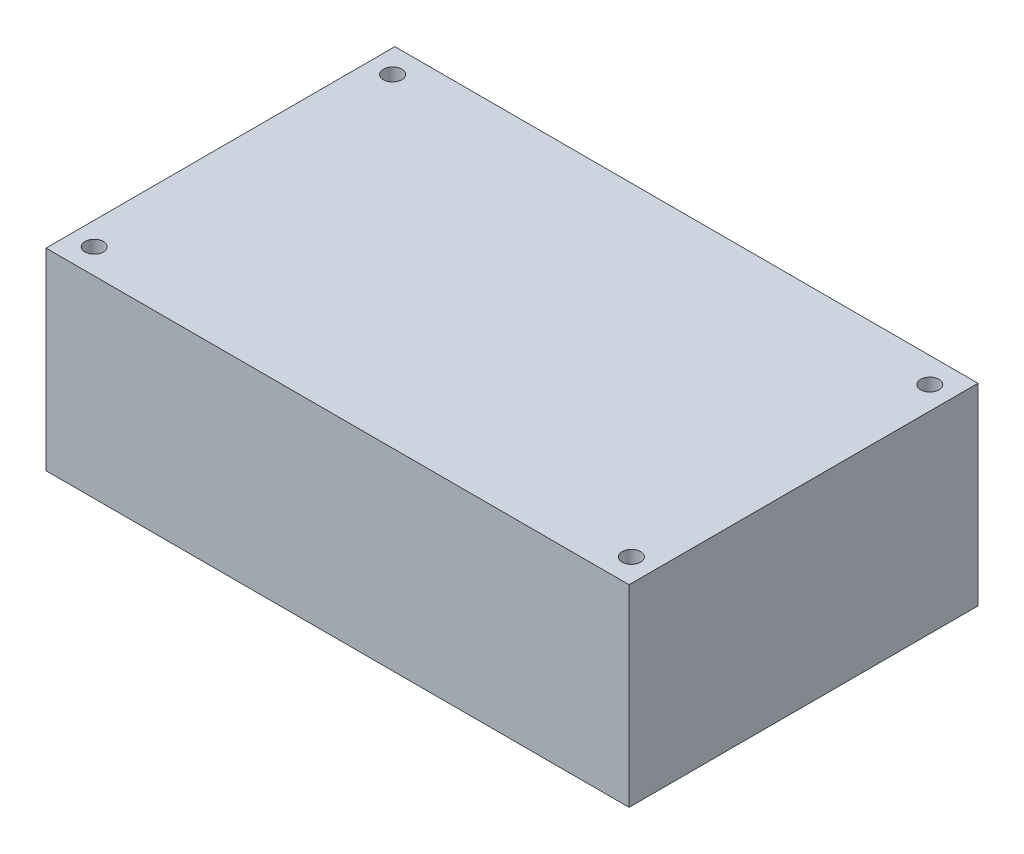
ISO-10303-21;
HEADER;
FILE_DESCRIPTION(('STEP AP214'),'2;1');
FILE_NAME('part.step','',(''),(''),'','','');
FILE_SCHEMA(('AUTOMOTIVE_DESIGN { 1 0 10303 214 1 1 1 1 }'));
ENDSEC;
DATA;
#1=APPLICATION_CONTEXT('core data for automotive mechanical design processes');
#2=APPLICATION_PROTOCOL_DEFINITION('international standard','automotive_design',2000,#1);
#3=PRODUCT_CONTEXT('',#1,'mechanical');
#4=PRODUCT('Part','Part','',(#3));
#5=PRODUCT_RELATED_PRODUCT_CATEGORY('part','',(#4));
#6=PRODUCT_DEFINITION_FORMATION('','',#4);
#7=PRODUCT_DEFINITION_CONTEXT('part definition',#1,'design');
#8=PRODUCT_DEFINITION('design','',#6,#7);
#9=PRODUCT_DEFINITION_SHAPE('','',#8);
#10=(LENGTH_UNIT() NAMED_UNIT(*) SI_UNIT(.MILLI.,.METRE.));
#11=(NAMED_UNIT(*) PLANE_ANGLE_UNIT() SI_UNIT($,.RADIAN.));
#12=(NAMED_UNIT(*) SI_UNIT($,.STERADIAN.) SOLID_ANGLE_UNIT());
#13=UNCERTAINTY_MEASURE_WITH_UNIT(LENGTH_MEASURE(1.E-05),#10,'distance_accuracy_value','');
#14=(GEOMETRIC_REPRESENTATION_CONTEXT(3) GLOBAL_UNCERTAINTY_ASSIGNED_CONTEXT((#13)) GLOBAL_UNIT_ASSIGNED_CONTEXT((#10,
#11,#12)) REPRESENTATION_CONTEXT('',''));
#15=CARTESIAN_POINT('',(0.,0.,0.));
#16=DIRECTION('',(0.,0.,1.));
#17=DIRECTION('',(1.,0.,0.));
#18=AXIS2_PLACEMENT_3D('',#15,#16,#17);
#19=CARTESIAN_POINT('',(63.5,42.,38.));
#20=DIRECTION('',(-1.,0.,0.));
#21=DIRECTION('',(0.,0.,1.));
#22=AXIS2_PLACEMENT_3D('',#19,#20,#21);
#23=PLANE('',#22);
#24=DIRECTION('',(0.,0.,-1.));
#25=VECTOR('',#24,1.);
#26=CARTESIAN_POINT('',(63.5,0.,38.));
#27=LINE('',#26,#25);
#28=CARTESIAN_POINT('',(63.5,0.,38.));
#29=VERTEX_POINT('',#28);
#30=CARTESIAN_POINT('',(63.5,0.,-38.));
#31=VERTEX_POINT('',#30);
#32=EDGE_CURVE('E96',#29,#31,#27,.T.);
#33=ORIENTED_EDGE('',*,*,#32,.T.);
#34=DIRECTION('',(0.,-1.,0.));
#35=VECTOR('',#34,1.);
#36=CARTESIAN_POINT('',(63.5,42.,-38.));
#37=LINE('',#36,#35);
#38=CARTESIAN_POINT('',(63.5,42.,-38.));
#39=VERTEX_POINT('',#38);
#40=EDGE_CURVE('E11',#39,#31,#37,.T.);
#41=ORIENTED_EDGE('',*,*,#40,.F.);
#42=DIRECTION('',(0.,0.,-1.));
#43=VECTOR('',#42,1.);
#44=CARTESIAN_POINT('',(63.5,42.,38.));
#45=LINE('',#44,#43);
#46=CARTESIAN_POINT('',(63.5,42.,38.));
#47=VERTEX_POINT('',#46);
#48=EDGE_CURVE('E84',#47,#39,#45,.T.);
#49=ORIENTED_EDGE('',*,*,#48,.F.);
#50=DIRECTION('',(0.,-1.,0.));
#51=VECTOR('',#50,1.);
#52=CARTESIAN_POINT('',(63.5,42.,38.));
#53=LINE('',#52,#51);
#54=EDGE_CURVE('E92',#47,#29,#53,.T.);
#55=ORIENTED_EDGE('',*,*,#54,.T.);
#56=EDGE_LOOP('',(#33,#41,#49,#55));
#57=FACE_BOUND('',#56,.T.);
#58=ADVANCED_FACE('F33',(#57),#23,.F.);
#59=CARTESIAN_POINT('',(-63.5,42.,-38.));
#60=DIRECTION('',(0.,0.,1.));
#61=DIRECTION('',(1.,0.,0.));
#62=AXIS2_PLACEMENT_3D('',#59,#60,#61);
#63=PLANE('',#62);
#64=DIRECTION('',(-1.,0.,0.));
#65=VECTOR('',#64,1.);
#66=CARTESIAN_POINT('',(-63.5,0.,-38.));
#67=LINE('',#66,#65);
#68=CARTESIAN_POINT('',(-63.5,0.,-38.));
#69=VERTEX_POINT('',#68);
#70=EDGE_CURVE('E88',#31,#69,#67,.T.);
#71=ORIENTED_EDGE('',*,*,#70,.T.);
#72=DIRECTION('',(0.,-1.,0.));
#73=VECTOR('',#72,1.);
#74=CARTESIAN_POINT('',(-63.5,42.,-38.));
#75=LINE('',#74,#73);
#76=CARTESIAN_POINT('',(-63.5,42.,-38.));
#77=VERTEX_POINT('',#76);
#78=EDGE_CURVE('E41',#77,#69,#75,.T.);
#79=ORIENTED_EDGE('',*,*,#78,.F.);
#80=DIRECTION('',(-1.,0.,0.));
#81=VECTOR('',#80,1.);
#82=CARTESIAN_POINT('',(-63.5,42.,-38.));
#83=LINE('',#82,#81);
#84=EDGE_CURVE('E79',#39,#77,#83,.T.);
#85=ORIENTED_EDGE('',*,*,#84,.F.);
#86=ORIENTED_EDGE('',*,*,#40,.T.);
#87=EDGE_LOOP('',(#71,#79,#85,#86));
#88=FACE_BOUND('',#87,.T.);
#89=ADVANCED_FACE('F87',(#88),#63,.F.);
#90=CARTESIAN_POINT('',(-63.5,42.,38.));
#91=DIRECTION('',(1.,0.,0.));
#92=DIRECTION('',(0.,0.,-1.));
#93=AXIS2_PLACEMENT_3D('',#90,#91,#92);
#94=PLANE('',#93);
#95=DIRECTION('',(0.,0.,1.));
#96=VECTOR('',#95,1.);
#97=CARTESIAN_POINT('',(-63.5,0.,38.));
#98=LINE('',#97,#96);
#99=CARTESIAN_POINT('',(-63.5,0.,38.));
#100=VERTEX_POINT('',#99);
#101=EDGE_CURVE('E66',#69,#100,#98,.T.);
#102=ORIENTED_EDGE('',*,*,#101,.T.);
#103=DIRECTION('',(0.,-1.,0.));
#104=VECTOR('',#103,1.);
#105=CARTESIAN_POINT('',(-63.5,42.,38.));
#106=LINE('',#105,#104);
#107=CARTESIAN_POINT('',(-63.5,42.,38.));
#108=VERTEX_POINT('',#107);
#109=EDGE_CURVE('E89',#108,#100,#106,.T.);
#110=ORIENTED_EDGE('',*,*,#109,.F.);
#111=DIRECTION('',(0.,0.,1.));
#112=VECTOR('',#111,1.);
#113=CARTESIAN_POINT('',(-63.5,42.,38.));
#114=LINE('',#113,#112);
#115=EDGE_CURVE('E82',#77,#108,#114,.T.);
#116=ORIENTED_EDGE('',*,*,#115,.F.);
#117=ORIENTED_EDGE('',*,*,#78,.T.);
#118=EDGE_LOOP('',(#102,#110,#116,#117));
#119=FACE_BOUND('',#118,.T.);
#120=ADVANCED_FACE('F90',(#119),#94,.F.);
#121=CARTESIAN_POINT('',(-63.5,42.,38.));
#122=DIRECTION('',(0.,0.,-1.));
#123=DIRECTION('',(-1.,0.,0.));
#124=AXIS2_PLACEMENT_3D('',#121,#122,#123);
#125=PLANE('',#124);
#126=DIRECTION('',(1.,0.,0.));
#127=VECTOR('',#126,1.);
#128=CARTESIAN_POINT('',(-63.5,0.,38.));
#129=LINE('',#128,#127);
#130=EDGE_CURVE('E72',#100,#29,#129,.T.);
#131=ORIENTED_EDGE('',*,*,#130,.T.);
#132=ORIENTED_EDGE('',*,*,#54,.F.);
#133=DIRECTION('',(1.,0.,0.));
#134=VECTOR('',#133,1.);
#135=CARTESIAN_POINT('',(-63.5,42.,38.));
#136=LINE('',#135,#134);
#137=EDGE_CURVE('E49',#108,#47,#136,.T.);
#138=ORIENTED_EDGE('',*,*,#137,.F.);
#139=ORIENTED_EDGE('',*,*,#109,.T.);
#140=EDGE_LOOP('',(#131,#132,#138,#139));
#141=FACE_BOUND('',#140,.T.);
#142=ADVANCED_FACE('F104',(#141),#125,.F.);
#143=CARTESIAN_POINT('',(0.,42.,0.));
#144=DIRECTION('',(0.,-1.,0.));
#145=DIRECTION('',(0.,0.,-1.));
#146=AXIS2_PLACEMENT_3D('',#143,#144,#145);
#147=PLANE('',#146);
#148=CARTESIAN_POINT('',(-58.4999999999993,42.,32.5));
#149=DIRECTION('',(0.,1.,0.));
#150=DIRECTION('',(0.,0.,1.));
#151=AXIS2_PLACEMENT_3D('',#148,#149,#150);
#152=CIRCLE('',#151,2.);
#153=CARTESIAN_POINT('',(-58.4999999999993,42.,34.5));
#154=VERTEX_POINT('',#153);
#155=EDGE_CURVE('E116',#154,#154,#152,.T.);
#156=ORIENTED_EDGE('',*,*,#155,.F.);
#157=EDGE_LOOP('',(#156));
#158=FACE_BOUND('',#157,.T.);
#159=CARTESIAN_POINT('',(58.5000000000007,42.,32.5));
#160=DIRECTION('',(0.,1.,0.));
#161=DIRECTION('',(0.,0.,1.));
#162=AXIS2_PLACEMENT_3D('',#159,#160,#161);
#163=CIRCLE('',#162,2.);
#164=CARTESIAN_POINT('',(58.5000000000007,42.,34.5));
#165=VERTEX_POINT('',#164);
#166=EDGE_CURVE('E122',#165,#165,#163,.T.);
#167=ORIENTED_EDGE('',*,*,#166,.F.);
#168=EDGE_LOOP('',(#167));
#169=FACE_BOUND('',#168,.T.);
#170=CARTESIAN_POINT('',(58.5,42.,-32.5));
#171=DIRECTION('',(0.,1.,0.));
#172=DIRECTION('',(0.,0.,1.));
#173=AXIS2_PLACEMENT_3D('',#170,#171,#172);
#174=CIRCLE('',#173,2.);
#175=CARTESIAN_POINT('',(58.5,42.,-30.5));
#176=VERTEX_POINT('',#175);
#177=EDGE_CURVE('E128',#176,#176,#174,.T.);
#178=ORIENTED_EDGE('',*,*,#177,.F.);
#179=EDGE_LOOP('',(#178));
#180=FACE_BOUND('',#179,.T.);
#181=CARTESIAN_POINT('',(-58.5,42.,-32.5));
#182=DIRECTION('',(0.,1.,0.));
#183=DIRECTION('',(0.,0.,1.));
#184=AXIS2_PLACEMENT_3D('',#181,#182,#183);
#185=CIRCLE('',#184,2.);
#186=CARTESIAN_POINT('',(-58.5,42.,-30.5));
#187=VERTEX_POINT('',#186);
#188=EDGE_CURVE('E110',#187,#187,#185,.T.);
#189=ORIENTED_EDGE('',*,*,#188,.F.);
#190=EDGE_LOOP('',(#189));
#191=FACE_BOUND('',#190,.T.);
#192=ORIENTED_EDGE('',*,*,#48,.T.);
#193=ORIENTED_EDGE('',*,*,#84,.T.);
#194=ORIENTED_EDGE('',*,*,#115,.T.);
#195=ORIENTED_EDGE('',*,*,#137,.T.);
#196=EDGE_LOOP('',(#192,#193,#194,#195));
#197=FACE_BOUND('',#196,.T.);
#198=ADVANCED_FACE('F80',(#158,#169,#180,#191,#197),#147,.F.);
#199=CARTESIAN_POINT('',(0.,0.,0.));
#200=DIRECTION('',(0.,-1.,0.));
#201=DIRECTION('',(0.,0.,-1.));
#202=AXIS2_PLACEMENT_3D('',#199,#200,#201);
#203=PLANE('',#202);
#204=CARTESIAN_POINT('',(-58.4999999999993,0.,32.5));
#205=DIRECTION('',(0.,1.,0.));
#206=DIRECTION('',(0.,0.,1.));
#207=AXIS2_PLACEMENT_3D('',#204,#205,#206);
#208=CIRCLE('',#207,2.);
#209=CARTESIAN_POINT('',(-58.4999999999993,0.,34.5));
#210=VERTEX_POINT('',#209);
#211=EDGE_CURVE('E119',#210,#210,#208,.T.);
#212=ORIENTED_EDGE('',*,*,#211,.T.);
#213=EDGE_LOOP('',(#212));
#214=FACE_BOUND('',#213,.T.);
#215=CARTESIAN_POINT('',(58.5000000000007,0.,32.5));
#216=DIRECTION('',(0.,1.,0.));
#217=DIRECTION('',(0.,0.,1.));
#218=AXIS2_PLACEMENT_3D('',#215,#216,#217);
#219=CIRCLE('',#218,2.);
#220=CARTESIAN_POINT('',(58.5000000000007,0.,34.5));
#221=VERTEX_POINT('',#220);
#222=EDGE_CURVE('E125',#221,#221,#219,.T.);
#223=ORIENTED_EDGE('',*,*,#222,.T.);
#224=EDGE_LOOP('',(#223));
#225=FACE_BOUND('',#224,.T.);
#226=CARTESIAN_POINT('',(58.5,0.,-32.5));
#227=DIRECTION('',(0.,1.,0.));
#228=DIRECTION('',(0.,0.,1.));
#229=AXIS2_PLACEMENT_3D('',#226,#227,#228);
#230=CIRCLE('',#229,2.);
#231=CARTESIAN_POINT('',(58.5,0.,-30.5));
#232=VERTEX_POINT('',#231);
#233=EDGE_CURVE('E113',#232,#232,#230,.T.);
#234=ORIENTED_EDGE('',*,*,#233,.T.);
#235=EDGE_LOOP('',(#234));
#236=FACE_BOUND('',#235,.T.);
#237=CARTESIAN_POINT('',(-58.5,0.,-32.5));
#238=DIRECTION('',(0.,1.,0.));
#239=DIRECTION('',(0.,0.,1.));
#240=AXIS2_PLACEMENT_3D('',#237,#238,#239);
#241=CIRCLE('',#240,2.);
#242=CARTESIAN_POINT('',(-58.5,0.,-30.5));
#243=VERTEX_POINT('',#242);
#244=EDGE_CURVE('E99',#243,#243,#241,.T.);
#245=ORIENTED_EDGE('',*,*,#244,.T.);
#246=EDGE_LOOP('',(#245));
#247=FACE_BOUND('',#246,.T.);
#248=ORIENTED_EDGE('',*,*,#32,.F.);
#249=ORIENTED_EDGE('',*,*,#130,.F.);
#250=ORIENTED_EDGE('',*,*,#101,.F.);
#251=ORIENTED_EDGE('',*,*,#70,.F.);
#252=EDGE_LOOP('',(#248,#249,#250,#251));
#253=FACE_BOUND('',#252,.T.);
#254=ADVANCED_FACE('F107',(#214,#225,#236,#247,#253),#203,.T.);
#255=CARTESIAN_POINT('',(-58.5,0.,-32.5));
#256=DIRECTION('',(0.,1.,0.));
#257=DIRECTION('',(0.,0.,1.));
#258=AXIS2_PLACEMENT_3D('',#255,#256,#257);
#259=CYLINDRICAL_SURFACE('',#258,2.);
#260=CARTESIAN_POINT('',(-58.5,0.,-30.5));
#261=CARTESIAN_POINT('',(-58.5,0.437499999999999,-30.5));
#262=CARTESIAN_POINT('',(-58.5,0.875,-30.5));
#263=CARTESIAN_POINT('',(-58.5,1.75,-30.5));
#264=CARTESIAN_POINT('',(-58.5,2.1875,-30.5));
#265=CARTESIAN_POINT('',(-58.5,3.0625,-30.5));
#266=CARTESIAN_POINT('',(-58.5,3.5,-30.5));
#267=CARTESIAN_POINT('',(-58.5,4.375,-30.5));
#268=CARTESIAN_POINT('',(-58.5,4.8125,-30.5));
#269=CARTESIAN_POINT('',(-58.5,5.6875,-30.5));
#270=CARTESIAN_POINT('',(-58.5,6.125,-30.5));
#271=CARTESIAN_POINT('',(-58.5,7.,-30.5));
#272=CARTESIAN_POINT('',(-58.5,7.4375,-30.5));
#273=CARTESIAN_POINT('',(-58.5,8.3125,-30.5));
#274=CARTESIAN_POINT('',(-58.5,8.75,-30.5));
#275=CARTESIAN_POINT('',(-58.5,9.625,-30.5));
#276=CARTESIAN_POINT('',(-58.5,10.0625,-30.5));
#277=CARTESIAN_POINT('',(-58.5,10.9375,-30.5));
#278=CARTESIAN_POINT('',(-58.5,11.375,-30.5));
#279=CARTESIAN_POINT('',(-58.5,12.25,-30.5));
#280=CARTESIAN_POINT('',(-58.5,12.6875,-30.5));
#281=CARTESIAN_POINT('',(-58.5,13.5625,-30.5));
#282=CARTESIAN_POINT('',(-58.5,14.,-30.5));
#283=CARTESIAN_POINT('',(-58.5,14.875,-30.5));
#284=CARTESIAN_POINT('',(-58.5,15.3125,-30.5));
#285=CARTESIAN_POINT('',(-58.5,16.1875,-30.5));
#286=CARTESIAN_POINT('',(-58.5,16.625,-30.5));
#287=CARTESIAN_POINT('',(-58.5,17.5,-30.5));
#288=CARTESIAN_POINT('',(-58.5,17.9375,-30.5));
#289=CARTESIAN_POINT('',(-58.5,18.8125,-30.5));
#290=CARTESIAN_POINT('',(-58.5,19.25,-30.5));
#291=CARTESIAN_POINT('',(-58.5,20.125,-30.5));
#292=CARTESIAN_POINT('',(-58.5,20.5625,-30.5));
#293=CARTESIAN_POINT('',(-58.5,21.4375,-30.5));
#294=CARTESIAN_POINT('',(-58.5,21.875,-30.5));
#295=CARTESIAN_POINT('',(-58.5,22.75,-30.5));
#296=CARTESIAN_POINT('',(-58.5,23.1875,-30.5));
#297=CARTESIAN_POINT('',(-58.5,24.0625,-30.5));
#298=CARTESIAN_POINT('',(-58.5,24.5,-30.5));
#299=CARTESIAN_POINT('',(-58.5,25.375,-30.5));
#300=CARTESIAN_POINT('',(-58.5,25.8125,-30.5));
#301=CARTESIAN_POINT('',(-58.5,26.6875,-30.5));
#302=CARTESIAN_POINT('',(-58.5,27.125,-30.5));
#303=CARTESIAN_POINT('',(-58.5,28.,-30.5));
#304=CARTESIAN_POINT('',(-58.5,28.4375,-30.5));
#305=CARTESIAN_POINT('',(-58.5,29.3125,-30.5));
#306=CARTESIAN_POINT('',(-58.5,29.75,-30.5));
#307=CARTESIAN_POINT('',(-58.5,30.625,-30.5));
#308=CARTESIAN_POINT('',(-58.5,31.0625,-30.5));
#309=CARTESIAN_POINT('',(-58.5,31.9375,-30.5));
#310=CARTESIAN_POINT('',(-58.5,32.375,-30.5));
#311=CARTESIAN_POINT('',(-58.5,33.25,-30.5));
#312=CARTESIAN_POINT('',(-58.5,33.6875,-30.5));
#313=CARTESIAN_POINT('',(-58.5,34.5625,-30.5));
#314=CARTESIAN_POINT('',(-58.5,35.,-30.5));
#315=CARTESIAN_POINT('',(-58.5,35.875,-30.5));
#316=CARTESIAN_POINT('',(-58.5,36.3125,-30.5));
#317=CARTESIAN_POINT('',(-58.5,37.1875,-30.5));
#318=CARTESIAN_POINT('',(-58.5,37.625,-30.5));
#319=CARTESIAN_POINT('',(-58.5,38.5,-30.5));
#320=CARTESIAN_POINT('',(-58.5,38.9375,-30.5));
#321=CARTESIAN_POINT('',(-58.5,39.8125,-30.5));
#322=CARTESIAN_POINT('',(-58.5,40.25,-30.5));
#323=CARTESIAN_POINT('',(-58.5,41.125,-30.5));
#324=CARTESIAN_POINT('',(-58.5,41.5625,-30.5));
#325=CARTESIAN_POINT('',(-58.5,42.,-30.5));
#326=B_SPLINE_CURVE_WITH_KNOTS('',3,(#260,#261,#262,#263,#264,#265,#266,#267,#268,#269,#270,
#271,#272,#273,#274,#275,#276,#277,#278,#279,#280,#281,#282,#283,#284,#285,#286,#287,#288,#289,
#290,#291,#292,#293,#294,#295,#296,#297,#298,#299,#300,#301,#302,#303,#304,#305,#306,#307,#308,
#309,#310,#311,#312,#313,#314,#315,#316,#317,#318,#319,#320,#321,#322,#323,#324,#325),
.UNSPECIFIED.,.F.,.F.,(4,2,2,2,2,2,2,2,2,2,2,2,2,2,2,2,2,2,2,2,2,2,2,2,2,2,2,2,2,2,2,2,4),(0.,
1.3125,2.625,3.9375,5.25,6.5625,7.875,9.1875,10.5,11.8125,13.125,14.4375,15.75,17.0625,18.375,
19.6875,21.,22.3125,23.625,24.9375,26.25,27.5625,28.875,30.1875,31.5,32.8125,34.125,35.4375,
36.75,38.0625,39.375,40.6875,42.),.UNSPECIFIED.);
#327=EDGE_CURVE('BSEAM140',#243,#187,#326,.T.);
#328=ORIENTED_EDGE('',*,*,#244,.F.);
#329=ORIENTED_EDGE('',*,*,#188,.T.);
#330=ORIENTED_EDGE('',*,*,#327,.T.);
#331=ORIENTED_EDGE('',*,*,#327,.F.);
#332=EDGE_LOOP('',(#328,#330,#329,#331));
#333=FACE_BOUND('',#332,.T.);
#334=ADVANCED_FACE('F140',(#333),#259,.F.);
#335=CARTESIAN_POINT('',(58.5,0.,-32.5));
#336=DIRECTION('',(0.,1.,0.));
#337=DIRECTION('',(0.,0.,1.));
#338=AXIS2_PLACEMENT_3D('',#335,#336,#337);
#339=CYLINDRICAL_SURFACE('',#338,2.);
#340=CARTESIAN_POINT('',(58.5,0.,-30.5));
#341=CARTESIAN_POINT('',(58.5,0.437499999999999,-30.5));
#342=CARTESIAN_POINT('',(58.5,0.875,-30.5));
#343=CARTESIAN_POINT('',(58.5,1.75,-30.5));
#344=CARTESIAN_POINT('',(58.5,2.1875,-30.5));
#345=CARTESIAN_POINT('',(58.5,3.0625,-30.5));
#346=CARTESIAN_POINT('',(58.5,3.5,-30.5));
#347=CARTESIAN_POINT('',(58.5,4.375,-30.5));
#348=CARTESIAN_POINT('',(58.5,4.8125,-30.5));
#349=CARTESIAN_POINT('',(58.5,5.6875,-30.5));
#350=CARTESIAN_POINT('',(58.5,6.125,-30.5));
#351=CARTESIAN_POINT('',(58.5,7.,-30.5));
#352=CARTESIAN_POINT('',(58.5,7.4375,-30.5));
#353=CARTESIAN_POINT('',(58.5,8.3125,-30.5));
#354=CARTESIAN_POINT('',(58.5,8.75,-30.5));
#355=CARTESIAN_POINT('',(58.5,9.625,-30.5));
#356=CARTESIAN_POINT('',(58.5,10.0625,-30.5));
#357=CARTESIAN_POINT('',(58.5,10.9375,-30.5));
#358=CARTESIAN_POINT('',(58.5,11.375,-30.5));
#359=CARTESIAN_POINT('',(58.5,12.25,-30.5));
#360=CARTESIAN_POINT('',(58.5,12.6875,-30.5));
#361=CARTESIAN_POINT('',(58.5,13.5625,-30.5));
#362=CARTESIAN_POINT('',(58.5,14.,-30.5));
#363=CARTESIAN_POINT('',(58.5,14.875,-30.5));
#364=CARTESIAN_POINT('',(58.5,15.3125,-30.5));
#365=CARTESIAN_POINT('',(58.5,16.1875,-30.5));
#366=CARTESIAN_POINT('',(58.5,16.625,-30.5));
#367=CARTESIAN_POINT('',(58.5,17.5,-30.5));
#368=CARTESIAN_POINT('',(58.5,17.9375,-30.5));
#369=CARTESIAN_POINT('',(58.5,18.8125,-30.5));
#370=CARTESIAN_POINT('',(58.5,19.25,-30.5));
#371=CARTESIAN_POINT('',(58.5,20.125,-30.5));
#372=CARTESIAN_POINT('',(58.5,20.5625,-30.5));
#373=CARTESIAN_POINT('',(58.5,21.4375,-30.5));
#374=CARTESIAN_POINT('',(58.5,21.875,-30.5));
#375=CARTESIAN_POINT('',(58.5,22.75,-30.5));
#376=CARTESIAN_POINT('',(58.5,23.1875,-30.5));
#377=CARTESIAN_POINT('',(58.5,24.0625,-30.5));
#378=CARTESIAN_POINT('',(58.5,24.5,-30.5));
#379=CARTESIAN_POINT('',(58.5,25.375,-30.5));
#380=CARTESIAN_POINT('',(58.5,25.8125,-30.5));
#381=CARTESIAN_POINT('',(58.5,26.6875,-30.5));
#382=CARTESIAN_POINT('',(58.5,27.125,-30.5));
#383=CARTESIAN_POINT('',(58.5,28.,-30.5));
#384=CARTESIAN_POINT('',(58.5,28.4375,-30.5));
#385=CARTESIAN_POINT('',(58.5,29.3125,-30.5));
#386=CARTESIAN_POINT('',(58.5,29.75,-30.5));
#387=CARTESIAN_POINT('',(58.5,30.625,-30.5));
#388=CARTESIAN_POINT('',(58.5,31.0625,-30.5));
#389=CARTESIAN_POINT('',(58.5,31.9375,-30.5));
#390=CARTESIAN_POINT('',(58.5,32.375,-30.5));
#391=CARTESIAN_POINT('',(58.5,33.25,-30.5));
#392=CARTESIAN_POINT('',(58.5,33.6875,-30.5));
#393=CARTESIAN_POINT('',(58.5,34.5625,-30.5));
#394=CARTESIAN_POINT('',(58.5,35.,-30.5));
#395=CARTESIAN_POINT('',(58.5,35.875,-30.5));
#396=CARTESIAN_POINT('',(58.5,36.3125,-30.5));
#397=CARTESIAN_POINT('',(58.5,37.1875,-30.5));
#398=CARTESIAN_POINT('',(58.5,37.625,-30.5));
#399=CARTESIAN_POINT('',(58.5,38.5,-30.5));
#400=CARTESIAN_POINT('',(58.5,38.9375,-30.5));
#401=CARTESIAN_POINT('',(58.5,39.8125,-30.5));
#402=CARTESIAN_POINT('',(58.5,40.25,-30.5));
#403=CARTESIAN_POINT('',(58.5,41.125,-30.5));
#404=CARTESIAN_POINT('',(58.5,41.5625,-30.5));
#405=CARTESIAN_POINT('',(58.5,42.,-30.5));
#406=B_SPLINE_CURVE_WITH_KNOTS('',3,(#340,#341,#342,#343,#344,#345,#346,#347,#348,#349,#350,
#351,#352,#353,#354,#355,#356,#357,#358,#359,#360,#361,#362,#363,#364,#365,#366,#367,#368,#369,
#370,#371,#372,#373,#374,#375,#376,#377,#378,#379,#380,#381,#382,#383,#384,#385,#386,#387,#388,
#389,#390,#391,#392,#393,#394,#395,#396,#397,#398,#399,#400,#401,#402,#403,#404,#405),
.UNSPECIFIED.,.F.,.F.,(4,2,2,2,2,2,2,2,2,2,2,2,2,2,2,2,2,2,2,2,2,2,2,2,2,2,2,2,2,2,2,2,4),(0.,
1.3125,2.625,3.9375,5.25,6.5625,7.875,9.1875,10.5,11.8125,13.125,14.4375,15.75,17.0625,18.375,
19.6875,21.,22.3125,23.625,24.9375,26.25,27.5625,28.875,30.1875,31.5,32.8125,34.125,35.4375,
36.75,38.0625,39.375,40.6875,42.),.UNSPECIFIED.);
#407=EDGE_CURVE('BSEAM136',#232,#176,#406,.T.);
#408=ORIENTED_EDGE('',*,*,#233,.F.);
#409=ORIENTED_EDGE('',*,*,#177,.T.);
#410=ORIENTED_EDGE('',*,*,#407,.T.);
#411=ORIENTED_EDGE('',*,*,#407,.F.);
#412=EDGE_LOOP('',(#408,#410,#409,#411));
#413=FACE_BOUND('',#412,.T.);
#414=ADVANCED_FACE('F136',(#413),#339,.F.);
#415=CARTESIAN_POINT('',(58.5000000000007,0.,32.5));
#416=DIRECTION('',(0.,1.,0.));
#417=DIRECTION('',(0.,0.,1.));
#418=AXIS2_PLACEMENT_3D('',#415,#416,#417);
#419=CYLINDRICAL_SURFACE('',#418,2.);
#420=CARTESIAN_POINT('',(58.5000000000007,0.,34.5));
#421=CARTESIAN_POINT('',(58.5000000000007,0.437499999999999,34.5));
#422=CARTESIAN_POINT('',(58.5000000000007,0.875,34.5));
#423=CARTESIAN_POINT('',(58.5000000000007,1.75,34.5));
#424=CARTESIAN_POINT('',(58.5000000000007,2.1875,34.5));
#425=CARTESIAN_POINT('',(58.5000000000007,3.0625,34.5));
#426=CARTESIAN_POINT('',(58.5000000000007,3.5,34.5));
#427=CARTESIAN_POINT('',(58.5000000000007,4.375,34.5));
#428=CARTESIAN_POINT('',(58.5000000000007,4.8125,34.5));
#429=CARTESIAN_POINT('',(58.5000000000007,5.6875,34.5));
#430=CARTESIAN_POINT('',(58.5000000000007,6.125,34.5));
#431=CARTESIAN_POINT('',(58.5000000000007,7.,34.5));
#432=CARTESIAN_POINT('',(58.5000000000007,7.4375,34.5));
#433=CARTESIAN_POINT('',(58.5000000000007,8.3125,34.5));
#434=CARTESIAN_POINT('',(58.5000000000007,8.75,34.5));
#435=CARTESIAN_POINT('',(58.5000000000007,9.625,34.5));
#436=CARTESIAN_POINT('',(58.5000000000007,10.0625,34.5));
#437=CARTESIAN_POINT('',(58.5000000000007,10.9375,34.5));
#438=CARTESIAN_POINT('',(58.5000000000007,11.375,34.5));
#439=CARTESIAN_POINT('',(58.5000000000007,12.25,34.5));
#440=CARTESIAN_POINT('',(58.5000000000007,12.6875,34.5));
#441=CARTESIAN_POINT('',(58.5000000000007,13.5625,34.5));
#442=CARTESIAN_POINT('',(58.5000000000007,14.,34.5));
#443=CARTESIAN_POINT('',(58.5000000000007,14.875,34.5));
#444=CARTESIAN_POINT('',(58.5000000000007,15.3125,34.5));
#445=CARTESIAN_POINT('',(58.5000000000007,16.1875,34.5));
#446=CARTESIAN_POINT('',(58.5000000000007,16.625,34.5));
#447=CARTESIAN_POINT('',(58.5000000000007,17.5,34.5));
#448=CARTESIAN_POINT('',(58.5000000000007,17.9375,34.5));
#449=CARTESIAN_POINT('',(58.5000000000007,18.8125,34.5));
#450=CARTESIAN_POINT('',(58.5000000000007,19.25,34.5));
#451=CARTESIAN_POINT('',(58.5000000000007,20.125,34.5));
#452=CARTESIAN_POINT('',(58.5000000000007,20.5625,34.5));
#453=CARTESIAN_POINT('',(58.5000000000007,21.4375,34.5));
#454=CARTESIAN_POINT('',(58.5000000000007,21.875,34.5));
#455=CARTESIAN_POINT('',(58.5000000000007,22.75,34.5));
#456=CARTESIAN_POINT('',(58.5000000000007,23.1875,34.5));
#457=CARTESIAN_POINT('',(58.5000000000007,24.0625,34.5));
#458=CARTESIAN_POINT('',(58.5000000000007,24.5,34.5));
#459=CARTESIAN_POINT('',(58.5000000000007,25.375,34.5));
#460=CARTESIAN_POINT('',(58.5000000000007,25.8125,34.5));
#461=CARTESIAN_POINT('',(58.5000000000007,26.6875,34.5));
#462=CARTESIAN_POINT('',(58.5000000000007,27.125,34.5));
#463=CARTESIAN_POINT('',(58.5000000000007,28.,34.5));
#464=CARTESIAN_POINT('',(58.5000000000007,28.4375,34.5));
#465=CARTESIAN_POINT('',(58.5000000000007,29.3125,34.5));
#466=CARTESIAN_POINT('',(58.5000000000007,29.75,34.5));
#467=CARTESIAN_POINT('',(58.5000000000007,30.625,34.5));
#468=CARTESIAN_POINT('',(58.5000000000007,31.0625,34.5));
#469=CARTESIAN_POINT('',(58.5000000000007,31.9375,34.5));
#470=CARTESIAN_POINT('',(58.5000000000007,32.375,34.5));
#471=CARTESIAN_POINT('',(58.5000000000007,33.25,34.5));
#472=CARTESIAN_POINT('',(58.5000000000007,33.6875,34.5));
#473=CARTESIAN_POINT('',(58.5000000000007,34.5625,34.5));
#474=CARTESIAN_POINT('',(58.5000000000007,35.,34.5));
#475=CARTESIAN_POINT('',(58.5000000000007,35.875,34.5));
#476=CARTESIAN_POINT('',(58.5000000000007,36.3125,34.5));
#477=CARTESIAN_POINT('',(58.5000000000007,37.1875,34.5));
#478=CARTESIAN_POINT('',(58.5000000000007,37.625,34.5));
#479=CARTESIAN_POINT('',(58.5000000000007,38.5,34.5));
#480=CARTESIAN_POINT('',(58.5000000000007,38.9375,34.5));
#481=CARTESIAN_POINT('',(58.5000000000007,39.8125,34.5));
#482=CARTESIAN_POINT('',(58.5000000000007,40.25,34.5));
#483=CARTESIAN_POINT('',(58.5000000000007,41.125,34.5));
#484=CARTESIAN_POINT('',(58.5000000000007,41.5625,34.5));
#485=CARTESIAN_POINT('',(58.5000000000007,42.,34.5));
#486=B_SPLINE_CURVE_WITH_KNOTS('',3,(#420,#421,#422,#423,#424,#425,#426,#427,#428,#429,#430,
#431,#432,#433,#434,#435,#436,#437,#438,#439,#440,#441,#442,#443,#444,#445,#446,#447,#448,#449,
#450,#451,#452,#453,#454,#455,#456,#457,#458,#459,#460,#461,#462,#463,#464,#465,#466,#467,#468,
#469,#470,#471,#472,#473,#474,#475,#476,#477,#478,#479,#480,#481,#482,#483,#484,#485),
.UNSPECIFIED.,.F.,.F.,(4,2,2,2,2,2,2,2,2,2,2,2,2,2,2,2,2,2,2,2,2,2,2,2,2,2,2,2,2,2,2,2,4),(0.,
1.3125,2.625,3.9375,5.25,6.5625,7.875,9.1875,10.5,11.8125,13.125,14.4375,15.75,17.0625,18.375,
19.6875,21.,22.3125,23.625,24.9375,26.25,27.5625,28.875,30.1875,31.5,32.8125,34.125,35.4375,
36.75,38.0625,39.375,40.6875,42.),.UNSPECIFIED.);
#487=EDGE_CURVE('BSEAM139',#221,#165,#486,.T.);
#488=ORIENTED_EDGE('',*,*,#222,.F.);
#489=ORIENTED_EDGE('',*,*,#166,.T.);
#490=ORIENTED_EDGE('',*,*,#487,.T.);
#491=ORIENTED_EDGE('',*,*,#487,.F.);
#492=EDGE_LOOP('',(#488,#490,#489,#491));
#493=FACE_BOUND('',#492,.T.);
#494=ADVANCED_FACE('F139',(#493),#419,.F.);
#495=CARTESIAN_POINT('',(-58.4999999999993,0.,32.5));
#496=DIRECTION('',(0.,1.,0.));
#497=DIRECTION('',(0.,0.,1.));
#498=AXIS2_PLACEMENT_3D('',#495,#496,#497);
#499=CYLINDRICAL_SURFACE('',#498,2.);
#500=CARTESIAN_POINT('',(-58.4999999999993,0.,34.5));
#501=CARTESIAN_POINT('',(-58.4999999999993,0.437499999999999,34.5));
#502=CARTESIAN_POINT('',(-58.4999999999993,0.875,34.5));
#503=CARTESIAN_POINT('',(-58.4999999999993,1.75,34.5));
#504=CARTESIAN_POINT('',(-58.4999999999993,2.1875,34.5));
#505=CARTESIAN_POINT('',(-58.4999999999993,3.0625,34.5));
#506=CARTESIAN_POINT('',(-58.4999999999993,3.5,34.5));
#507=CARTESIAN_POINT('',(-58.4999999999993,4.375,34.5));
#508=CARTESIAN_POINT('',(-58.4999999999993,4.8125,34.5));
#509=CARTESIAN_POINT('',(-58.4999999999993,5.6875,34.5));
#510=CARTESIAN_POINT('',(-58.4999999999993,6.125,34.5));
#511=CARTESIAN_POINT('',(-58.4999999999993,7.,34.5));
#512=CARTESIAN_POINT('',(-58.4999999999993,7.4375,34.5));
#513=CARTESIAN_POINT('',(-58.4999999999993,8.3125,34.5));
#514=CARTESIAN_POINT('',(-58.4999999999993,8.75,34.5));
#515=CARTESIAN_POINT('',(-58.4999999999993,9.625,34.5));
#516=CARTESIAN_POINT('',(-58.4999999999993,10.0625,34.5));
#517=CARTESIAN_POINT('',(-58.4999999999993,10.9375,34.5));
#518=CARTESIAN_POINT('',(-58.4999999999993,11.375,34.5));
#519=CARTESIAN_POINT('',(-58.4999999999993,12.25,34.5));
#520=CARTESIAN_POINT('',(-58.4999999999993,12.6875,34.5));
#521=CARTESIAN_POINT('',(-58.4999999999993,13.5625,34.5));
#522=CARTESIAN_POINT('',(-58.4999999999993,14.,34.5));
#523=CARTESIAN_POINT('',(-58.4999999999993,14.875,34.5));
#524=CARTESIAN_POINT('',(-58.4999999999993,15.3125,34.5));
#525=CARTESIAN_POINT('',(-58.4999999999993,16.1875,34.5));
#526=CARTESIAN_POINT('',(-58.4999999999993,16.625,34.5));
#527=CARTESIAN_POINT('',(-58.4999999999993,17.5,34.5));
#528=CARTESIAN_POINT('',(-58.4999999999993,17.9375,34.5));
#529=CARTESIAN_POINT('',(-58.4999999999993,18.8125,34.5));
#530=CARTESIAN_POINT('',(-58.4999999999993,19.25,34.5));
#531=CARTESIAN_POINT('',(-58.4999999999993,20.125,34.5));
#532=CARTESIAN_POINT('',(-58.4999999999993,20.5625,34.5));
#533=CARTESIAN_POINT('',(-58.4999999999993,21.4375,34.5));
#534=CARTESIAN_POINT('',(-58.4999999999993,21.875,34.5));
#535=CARTESIAN_POINT('',(-58.4999999999993,22.75,34.5));
#536=CARTESIAN_POINT('',(-58.4999999999993,23.1875,34.5));
#537=CARTESIAN_POINT('',(-58.4999999999993,24.0625,34.5));
#538=CARTESIAN_POINT('',(-58.4999999999993,24.5,34.5));
#539=CARTESIAN_POINT('',(-58.4999999999993,25.375,34.5));
#540=CARTESIAN_POINT('',(-58.4999999999993,25.8125,34.5));
#541=CARTESIAN_POINT('',(-58.4999999999993,26.6875,34.5));
#542=CARTESIAN_POINT('',(-58.4999999999993,27.125,34.5));
#543=CARTESIAN_POINT('',(-58.4999999999993,28.,34.5));
#544=CARTESIAN_POINT('',(-58.4999999999993,28.4375,34.5));
#545=CARTESIAN_POINT('',(-58.4999999999993,29.3125,34.5));
#546=CARTESIAN_POINT('',(-58.4999999999993,29.75,34.5));
#547=CARTESIAN_POINT('',(-58.4999999999993,30.625,34.5));
#548=CARTESIAN_POINT('',(-58.4999999999993,31.0625,34.5));
#549=CARTESIAN_POINT('',(-58.4999999999993,31.9375,34.5));
#550=CARTESIAN_POINT('',(-58.4999999999993,32.375,34.5));
#551=CARTESIAN_POINT('',(-58.4999999999993,33.25,34.5));
#552=CARTESIAN_POINT('',(-58.4999999999993,33.6875,34.5));
#553=CARTESIAN_POINT('',(-58.4999999999993,34.5625,34.5));
#554=CARTESIAN_POINT('',(-58.4999999999993,35.,34.5));
#555=CARTESIAN_POINT('',(-58.4999999999993,35.875,34.5));
#556=CARTESIAN_POINT('',(-58.4999999999993,36.3125,34.5));
#557=CARTESIAN_POINT('',(-58.4999999999993,37.1875,34.5));
#558=CARTESIAN_POINT('',(-58.4999999999993,37.625,34.5));
#559=CARTESIAN_POINT('',(-58.4999999999993,38.5,34.5));
#560=CARTESIAN_POINT('',(-58.4999999999993,38.9375,34.5));
#561=CARTESIAN_POINT('',(-58.4999999999993,39.8125,34.5));
#562=CARTESIAN_POINT('',(-58.4999999999993,40.25,34.5));
#563=CARTESIAN_POINT('',(-58.4999999999993,41.125,34.5));
#564=CARTESIAN_POINT('',(-58.4999999999993,41.5625,34.5));
#565=CARTESIAN_POINT('',(-58.4999999999993,42.,34.5));
#566=B_SPLINE_CURVE_WITH_KNOTS('',3,(#500,#501,#502,#503,#504,#505,#506,#507,#508,#509,#510,
#511,#512,#513,#514,#515,#516,#517,#518,#519,#520,#521,#522,#523,#524,#525,#526,#527,#528,#529,
#530,#531,#532,#533,#534,#535,#536,#537,#538,#539,#540,#541,#542,#543,#544,#545,#546,#547,#548,
#549,#550,#551,#552,#553,#554,#555,#556,#557,#558,#559,#560,#561,#562,#563,#564,#565),
.UNSPECIFIED.,.F.,.F.,(4,2,2,2,2,2,2,2,2,2,2,2,2,2,2,2,2,2,2,2,2,2,2,2,2,2,2,2,2,2,2,2,4),(0.,
1.3125,2.625,3.9375,5.25,6.5625,7.875,9.1875,10.5,11.8125,13.125,14.4375,15.75,17.0625,18.375,
19.6875,21.,22.3125,23.625,24.9375,26.25,27.5625,28.875,30.1875,31.5,32.8125,34.125,35.4375,
36.75,38.0625,39.375,40.6875,42.),.UNSPECIFIED.);
#567=EDGE_CURVE('BSEAM203',#210,#154,#566,.T.);
#568=ORIENTED_EDGE('',*,*,#211,.F.);
#569=ORIENTED_EDGE('',*,*,#155,.T.);
#570=ORIENTED_EDGE('',*,*,#567,.T.);
#571=ORIENTED_EDGE('',*,*,#567,.F.);
#572=EDGE_LOOP('',(#568,#570,#569,#571));
#573=FACE_BOUND('',#572,.T.);
#574=ADVANCED_FACE('F203',(#573),#499,.F.);
#575=CLOSED_SHELL('',(#58,#89,#120,#142,#198,#254,#334,#414,#494,#574));
#576=MANIFOLD_SOLID_BREP('B2',#575);
#577=ADVANCED_BREP_SHAPE_REPRESENTATION('',(#18,#576),#14);
#578=SHAPE_DEFINITION_REPRESENTATION(#9,#577);
ENDSEC;
END-ISO-10303-21;
